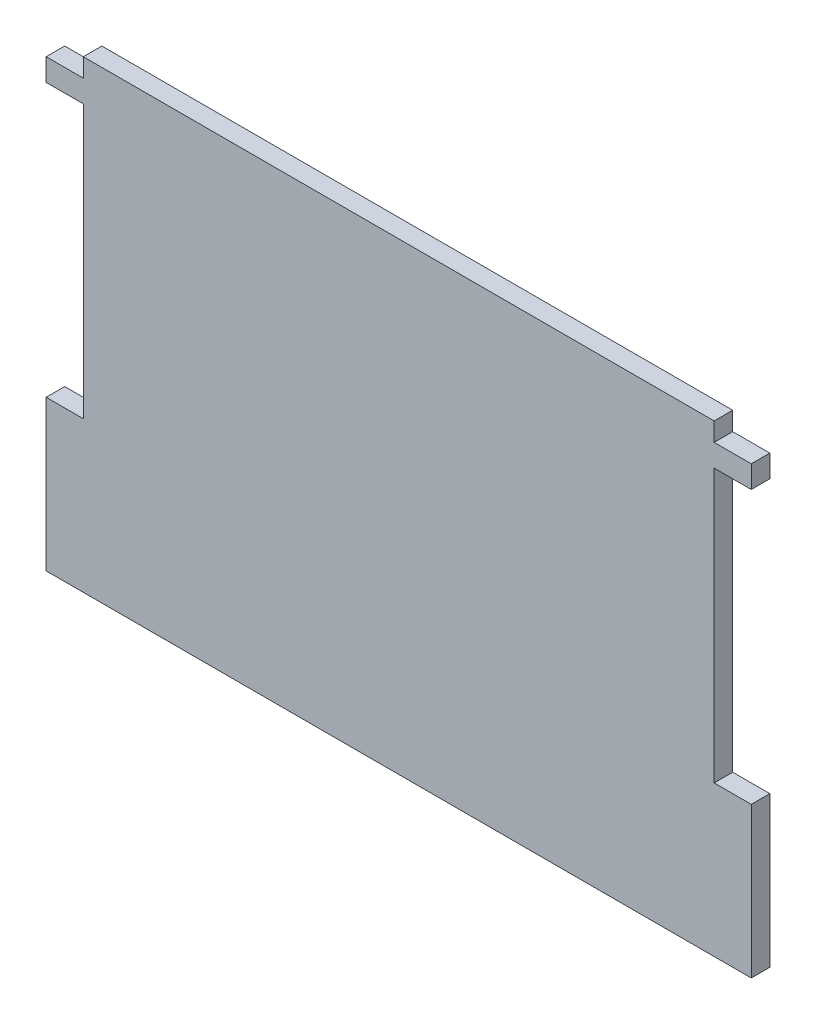
ISO-10303-21;
HEADER;
FILE_DESCRIPTION(('STEP AP214'),'2;1');
FILE_NAME('part.step','',(''),(''),'','','');
FILE_SCHEMA(('AUTOMOTIVE_DESIGN { 1 0 10303 214 1 1 1 1 }'));
ENDSEC;
DATA;
#1=APPLICATION_CONTEXT('core data for automotive mechanical design processes');
#2=APPLICATION_PROTOCOL_DEFINITION('international standard','automotive_design',2000,#1);
#3=PRODUCT_CONTEXT('',#1,'mechanical');
#4=PRODUCT('Part','Part','',(#3));
#5=PRODUCT_RELATED_PRODUCT_CATEGORY('part','',(#4));
#6=PRODUCT_DEFINITION_FORMATION('','',#4);
#7=PRODUCT_DEFINITION_CONTEXT('part definition',#1,'design');
#8=PRODUCT_DEFINITION('design','',#6,#7);
#9=PRODUCT_DEFINITION_SHAPE('','',#8);
#10=(LENGTH_UNIT() NAMED_UNIT(*) SI_UNIT(.MILLI.,.METRE.));
#11=(NAMED_UNIT(*) PLANE_ANGLE_UNIT() SI_UNIT($,.RADIAN.));
#12=(NAMED_UNIT(*) SI_UNIT($,.STERADIAN.) SOLID_ANGLE_UNIT());
#13=UNCERTAINTY_MEASURE_WITH_UNIT(LENGTH_MEASURE(1.E-05),#10,'distance_accuracy_value','');
#14=(GEOMETRIC_REPRESENTATION_CONTEXT(3) GLOBAL_UNCERTAINTY_ASSIGNED_CONTEXT((#13)) GLOBAL_UNIT_ASSIGNED_CONTEXT((#10,
#11,#12)) REPRESENTATION_CONTEXT('',''));
#15=CARTESIAN_POINT('',(0.,0.,0.));
#16=DIRECTION('',(0.,0.,1.));
#17=DIRECTION('',(1.,0.,0.));
#18=AXIS2_PLACEMENT_3D('',#15,#16,#17);
#19=CARTESIAN_POINT('',(0.,0.,0.));
#20=DIRECTION('',(0.,0.,-1.));
#21=DIRECTION('',(-1.,0.,0.));
#22=AXIS2_PLACEMENT_3D('',#19,#20,#21);
#23=PLANE('',#22);
#24=DIRECTION('',(1.,0.,0.));
#25=VECTOR('',#24,1.);
#26=CARTESIAN_POINT('',(-17.,-0.5,0.));
#27=LINE('',#26,#25);
#28=CARTESIAN_POINT('',(17.,-0.5,0.));
#29=VERTEX_POINT('',#28);
#30=CARTESIAN_POINT('',(-17.,-0.5,0.));
#31=VERTEX_POINT('',#30);
#32=EDGE_CURVE('E11',#29,#31,#27,.F.);
#33=ORIENTED_EDGE('',*,*,#32,.F.);
#34=DIRECTION('',(0.,1.,0.));
#35=VECTOR('',#34,1.);
#36=CARTESIAN_POINT('',(17.,-0.5,0.));
#37=LINE('',#36,#35);
#38=CARTESIAN_POINT('',(17.,-1.5,0.));
#39=VERTEX_POINT('',#38);
#40=EDGE_CURVE('E106',#39,#29,#37,.T.);
#41=ORIENTED_EDGE('',*,*,#40,.F.);
#42=DIRECTION('',(1.,0.,0.));
#43=VECTOR('',#42,1.);
#44=CARTESIAN_POINT('',(17.,-1.5,0.));
#45=LINE('',#44,#43);
#46=CARTESIAN_POINT('',(19.,-1.5,0.));
#47=VERTEX_POINT('',#46);
#48=EDGE_CURVE('E308',#47,#39,#45,.F.);
#49=ORIENTED_EDGE('',*,*,#48,.F.);
#50=DIRECTION('',(0.,1.,0.));
#51=VECTOR('',#50,1.);
#52=CARTESIAN_POINT('',(19.,-1.5,0.));
#53=LINE('',#52,#51);
#54=CARTESIAN_POINT('',(19.,-2.7,0.));
#55=VERTEX_POINT('',#54);
#56=EDGE_CURVE('E306',#55,#47,#53,.T.);
#57=ORIENTED_EDGE('',*,*,#56,.F.);
#58=DIRECTION('',(1.,0.,0.));
#59=VECTOR('',#58,1.);
#60=CARTESIAN_POINT('',(19.,-2.7,0.));
#61=LINE('',#60,#59);
#62=CARTESIAN_POINT('',(17.,-2.7,0.));
#63=VERTEX_POINT('',#62);
#64=EDGE_CURVE('E307',#63,#55,#61,.T.);
#65=ORIENTED_EDGE('',*,*,#64,.F.);
#66=DIRECTION('',(0.,1.,0.));
#67=VECTOR('',#66,1.);
#68=CARTESIAN_POINT('',(17.,-2.7,0.));
#69=LINE('',#68,#67);
#70=CARTESIAN_POINT('',(17.,-17.3947217067352,0.));
#71=VERTEX_POINT('',#70);
#72=EDGE_CURVE('E315',#71,#63,#69,.T.);
#73=ORIENTED_EDGE('',*,*,#72,.F.);
#74=DIRECTION('',(1.,0.,0.));
#75=VECTOR('',#74,1.);
#76=CARTESIAN_POINT('',(17.,-17.3947217067352,0.));
#77=LINE('',#76,#75);
#78=CARTESIAN_POINT('',(19.,-17.3947217067352,0.));
#79=VERTEX_POINT('',#78);
#80=EDGE_CURVE('E312',#79,#71,#77,.F.);
#81=ORIENTED_EDGE('',*,*,#80,.F.);
#82=DIRECTION('',(0.,1.,0.));
#83=VECTOR('',#82,1.);
#84=CARTESIAN_POINT('',(19.,-17.3947217067352,0.));
#85=LINE('',#84,#83);
#86=CARTESIAN_POINT('',(19.,-25.5,0.));
#87=VERTEX_POINT('',#86);
#88=EDGE_CURVE('E316',#87,#79,#85,.T.);
#89=ORIENTED_EDGE('',*,*,#88,.F.);
#90=DIRECTION('',(1.,0.,0.));
#91=VECTOR('',#90,1.);
#92=CARTESIAN_POINT('',(19.,-25.5,0.));
#93=LINE('',#92,#91);
#94=CARTESIAN_POINT('',(-19.,-25.5,0.));
#95=VERTEX_POINT('',#94);
#96=EDGE_CURVE('E318',#95,#87,#93,.T.);
#97=ORIENTED_EDGE('',*,*,#96,.F.);
#98=DIRECTION('',(0.,1.,0.));
#99=VECTOR('',#98,1.);
#100=CARTESIAN_POINT('',(-19.,-25.5,0.));
#101=LINE('',#100,#99);
#102=CARTESIAN_POINT('',(-19.,-17.3947217067352,0.));
#103=VERTEX_POINT('',#102);
#104=EDGE_CURVE('E319',#103,#95,#101,.F.);
#105=ORIENTED_EDGE('',*,*,#104,.F.);
#106=DIRECTION('',(1.,0.,0.));
#107=VECTOR('',#106,1.);
#108=CARTESIAN_POINT('',(-19.,-17.3947217067352,0.));
#109=LINE('',#108,#107);
#110=CARTESIAN_POINT('',(-17.,-17.3947217067352,0.));
#111=VERTEX_POINT('',#110);
#112=EDGE_CURVE('E325',#111,#103,#109,.F.);
#113=ORIENTED_EDGE('',*,*,#112,.F.);
#114=DIRECTION('',(0.,1.,0.));
#115=VECTOR('',#114,1.);
#116=CARTESIAN_POINT('',(-17.,-17.3947217067352,0.));
#117=LINE('',#116,#115);
#118=CARTESIAN_POINT('',(-17.,-2.7,0.));
#119=VERTEX_POINT('',#118);
#120=EDGE_CURVE('E323',#119,#111,#117,.F.);
#121=ORIENTED_EDGE('',*,*,#120,.F.);
#122=DIRECTION('',(1.,0.,0.));
#123=VECTOR('',#122,1.);
#124=CARTESIAN_POINT('',(-17.,-2.7,0.));
#125=LINE('',#124,#123);
#126=CARTESIAN_POINT('',(-19.,-2.7,0.));
#127=VERTEX_POINT('',#126);
#128=EDGE_CURVE('E327',#127,#119,#125,.T.);
#129=ORIENTED_EDGE('',*,*,#128,.F.);
#130=DIRECTION('',(0.,1.,0.));
#131=VECTOR('',#130,1.);
#132=CARTESIAN_POINT('',(-19.,-2.7,0.));
#133=LINE('',#132,#131);
#134=CARTESIAN_POINT('',(-19.,-1.5,0.));
#135=VERTEX_POINT('',#134);
#136=EDGE_CURVE('E329',#135,#127,#133,.F.);
#137=ORIENTED_EDGE('',*,*,#136,.F.);
#138=DIRECTION('',(1.,0.,0.));
#139=VECTOR('',#138,1.);
#140=CARTESIAN_POINT('',(-19.,-1.5,0.));
#141=LINE('',#140,#139);
#142=CARTESIAN_POINT('',(-17.,-1.5,0.));
#143=VERTEX_POINT('',#142);
#144=EDGE_CURVE('E328',#143,#135,#141,.F.);
#145=ORIENTED_EDGE('',*,*,#144,.F.);
#146=DIRECTION('',(0.,1.,0.));
#147=VECTOR('',#146,1.);
#148=CARTESIAN_POINT('',(-17.,-1.5,0.));
#149=LINE('',#148,#147);
#150=EDGE_CURVE('E48',#31,#143,#149,.F.);
#151=ORIENTED_EDGE('',*,*,#150,.F.);
#152=EDGE_LOOP('',(#33,#41,#49,#57,#65,#73,#81,#89,#97,#105,#113,#121,#129,#137,#145,#151));
#153=FACE_BOUND('',#152,.T.);
#154=CARTESIAN_POINT('',(1.92307692307694,-19.6153846153846,0.));
#155=CARTESIAN_POINT('',(1.77113809650168,-19.5202345564834,0.));
#156=CARTESIAN_POINT('',(1.46878250241927,-19.3308876118314,0.));
#157=CARTESIAN_POINT('',(1.0804243240048,-18.9568251895871,0.));
#158=CARTESIAN_POINT('',(0.760410940366441,-18.517308434697,0.));
#159=CARTESIAN_POINT('',(0.495090367822198,-18.0099272751774,0.));
#160=CARTESIAN_POINT('',(0.290092377329316,-17.4127986509036,0.));
#161=CARTESIAN_POINT('',(0.146567444426938,-16.7079392684701,0.));
#162=CARTESIAN_POINT('',(0.0444548234273604,-15.8921756964286,0.));
#163=CARTESIAN_POINT('',(0.0232473161701429,-15.3088405079473,0.));
#164=CARTESIAN_POINT('',(0.0120192307692477,-15.,0.));
#165=B_SPLINE_CURVE_WITH_KNOTS('',3,(#154,#155,#156,#157,#158,#159,#160,#161,#162,#163,#164),
.UNSPECIFIED.,.F.,.F.,(4,1,1,1,1,1,1,1,4),(0.,0.102367245238738,0.20370901859906,
0.30618529824539,0.412314489693373,0.530130196862162,0.666144691715152,0.823243917000724,1.),.UNSPECIFIED.);
#166=CARTESIAN_POINT('',(1.92307692307694,-19.6153846153846,0.));
#167=VERTEX_POINT('',#166);
#168=CARTESIAN_POINT('',(0.0120192307692477,-15.,0.));
#169=VERTEX_POINT('',#168);
#170=EDGE_CURVE('E216',#167,#169,#165,.T.);
#171=ORIENTED_EDGE('',*,*,#170,.T.);
#172=DIRECTION('',(1.,0.,0.));
#173=VECTOR('',#172,1.);
#174=CARTESIAN_POINT('',(0.0120192307692477,-15.,0.));
#175=LINE('',#174,#173);
#176=CARTESIAN_POINT('',(1.92307692307694,-15.,0.));
#177=VERTEX_POINT('',#176);
#178=EDGE_CURVE('E54',#169,#177,#175,.T.);
#179=ORIENTED_EDGE('',*,*,#178,.T.);
#180=DIRECTION('',(0.,1.,0.));
#181=VECTOR('',#180,1.);
#182=CARTESIAN_POINT('',(1.92307692307694,-15.,0.));
#183=LINE('',#182,#181);
#184=CARTESIAN_POINT('',(1.92307692307694,-11.1538461538462,0.));
#185=VERTEX_POINT('',#184);
#186=EDGE_CURVE('E225',#177,#185,#183,.T.);
#187=ORIENTED_EDGE('',*,*,#186,.T.);
#188=DIRECTION('',(-1.,0.,0.));
#189=VECTOR('',#188,1.);
#190=CARTESIAN_POINT('',(1.92307692307694,-11.1538461538462,0.));
#191=LINE('',#190,#189);
#192=CARTESIAN_POINT('',(-1.92307692307691,-11.1538461538462,0.));
#193=VERTEX_POINT('',#192);
#194=EDGE_CURVE('E727',#185,#193,#191,.T.);
#195=ORIENTED_EDGE('',*,*,#194,.T.);
#196=DIRECTION('',(0.,-1.,0.));
#197=VECTOR('',#196,1.);
#198=CARTESIAN_POINT('',(-1.92307692307691,-11.1538461538462,0.));
#199=LINE('',#198,#197);
#200=CARTESIAN_POINT('',(-1.92307692307691,-15.,0.));
#201=VERTEX_POINT('',#200);
#202=EDGE_CURVE('E724',#193,#201,#199,.T.);
#203=ORIENTED_EDGE('',*,*,#202,.T.);
#204=CARTESIAN_POINT('',(-1.92307692307691,-15.,0.));
#205=CARTESIAN_POINT('',(-1.91433657056015,-15.3810767358832,0.));
#206=CARTESIAN_POINT('',(-1.89766609116232,-16.1079046140902,0.));
#207=CARTESIAN_POINT('',(-1.76020005937377,-17.1394582093312,0.));
#208=CARTESIAN_POINT('',(-1.536476701543,-18.0601395414614,0.));
#209=CARTESIAN_POINT('',(-1.21069108944097,-18.8711982332195,0.));
#210=CARTESIAN_POINT('',(-0.785119946019379,-19.5855678421094,0.));
#211=CARTESIAN_POINT('',(-0.242975559569955,-20.2021133103051,0.));
#212=CARTESIAN_POINT('',(0.40399486861272,-20.737784557651,0.));
#213=CARTESIAN_POINT('',(0.900466251360351,-21.0132560811903,0.));
#214=CARTESIAN_POINT('',(1.15384615384617,-21.1538461538462,0.));
#215=B_SPLINE_CURVE_WITH_KNOTS('',3,(#204,#205,#206,#207,#208,#209,#210,#211,#212,#213,#214),
.UNSPECIFIED.,.F.,.F.,(4,1,1,1,1,1,1,1,4),(0.,0.156601585827271,0.298686294997552,
0.426910206074715,0.545117488967752,0.656687364828344,0.767001116976198,0.881086329823996,1.),.UNSPECIFIED.);
#216=CARTESIAN_POINT('',(1.15384615384617,-21.1538461538462,0.));
#217=VERTEX_POINT('',#216);
#218=EDGE_CURVE('E717',#201,#217,#215,.T.);
#219=ORIENTED_EDGE('',*,*,#218,.T.);
#220=DIRECTION('',(0.447213595499958,0.894427190999916,0.));
#221=VECTOR('',#220,1.);
#222=CARTESIAN_POINT('',(1.15384615384617,-21.1538461538462,0.));
#223=LINE('',#222,#221);
#224=EDGE_CURVE('E713',#217,#167,#223,.T.);
#225=ORIENTED_EDGE('',*,*,#224,.T.);
#226=EDGE_LOOP('',(#171,#179,#187,#195,#203,#219,#225));
#227=FACE_BOUND('',#226,.T.);
#228=ADVANCED_FACE('F39',(#153,#227),#23,.T.);
#229=CARTESIAN_POINT('',(-17.,-0.5,1.));
#230=DIRECTION('',(0.,-1.,0.));
#231=DIRECTION('',(0.,0.,-1.));
#232=AXIS2_PLACEMENT_3D('',#229,#230,#231);
#233=PLANE('',#232);
#234=ORIENTED_EDGE('',*,*,#32,.T.);
#235=DIRECTION('',(0.,0.,-1.));
#236=VECTOR('',#235,1.);
#237=CARTESIAN_POINT('',(-17.,-0.5,1.));
#238=LINE('',#237,#236);
#239=CARTESIAN_POINT('',(-17.,-0.5,1.));
#240=VERTEX_POINT('',#239);
#241=EDGE_CURVE('E223',#240,#31,#238,.T.);
#242=ORIENTED_EDGE('',*,*,#241,.F.);
#243=DIRECTION('',(-1.,0.,0.));
#244=VECTOR('',#243,1.);
#245=CARTESIAN_POINT('',(-17.,-0.5,1.));
#246=LINE('',#245,#244);
#247=CARTESIAN_POINT('',(17.,-0.5,1.));
#248=VERTEX_POINT('',#247);
#249=EDGE_CURVE('E265',#248,#240,#246,.T.);
#250=ORIENTED_EDGE('',*,*,#249,.F.);
#251=DIRECTION('',(0.,0.,-1.));
#252=VECTOR('',#251,1.);
#253=CARTESIAN_POINT('',(17.,-0.5,1.));
#254=LINE('',#253,#252);
#255=EDGE_CURVE('E234',#248,#29,#254,.T.);
#256=ORIENTED_EDGE('',*,*,#255,.T.);
#257=EDGE_LOOP('',(#234,#242,#250,#256));
#258=FACE_BOUND('',#257,.T.);
#259=ADVANCED_FACE('F404',(#258),#233,.F.);
#260=CARTESIAN_POINT('',(-17.,-1.5,1.));
#261=DIRECTION('',(1.,0.,0.));
#262=DIRECTION('',(0.,0.,-1.));
#263=AXIS2_PLACEMENT_3D('',#260,#261,#262);
#264=PLANE('',#263);
#265=ORIENTED_EDGE('',*,*,#150,.T.);
#266=DIRECTION('',(0.,0.,-1.));
#267=VECTOR('',#266,1.);
#268=CARTESIAN_POINT('',(-17.,-1.5,1.));
#269=LINE('',#268,#267);
#270=CARTESIAN_POINT('',(-17.,-1.5,1.));
#271=VERTEX_POINT('',#270);
#272=EDGE_CURVE('E226',#271,#143,#269,.T.);
#273=ORIENTED_EDGE('',*,*,#272,.F.);
#274=DIRECTION('',(0.,-1.,0.));
#275=VECTOR('',#274,1.);
#276=CARTESIAN_POINT('',(-17.,-1.5,1.));
#277=LINE('',#276,#275);
#278=EDGE_CURVE('E119',#240,#271,#277,.T.);
#279=ORIENTED_EDGE('',*,*,#278,.F.);
#280=ORIENTED_EDGE('',*,*,#241,.T.);
#281=EDGE_LOOP('',(#265,#273,#279,#280));
#282=FACE_BOUND('',#281,.T.);
#283=ADVANCED_FACE('F332',(#282),#264,.F.);
#284=CARTESIAN_POINT('',(-19.,-1.5,1.));
#285=DIRECTION('',(0.,-1.,0.));
#286=DIRECTION('',(1.,0.,0.));
#287=AXIS2_PLACEMENT_3D('',#284,#285,#286);
#288=PLANE('',#287);
#289=ORIENTED_EDGE('',*,*,#144,.T.);
#290=DIRECTION('',(0.,0.,-1.));
#291=VECTOR('',#290,1.);
#292=CARTESIAN_POINT('',(-19.,-1.5,1.));
#293=LINE('',#292,#291);
#294=CARTESIAN_POINT('',(-19.,-1.5,1.));
#295=VERTEX_POINT('',#294);
#296=EDGE_CURVE('E268',#295,#135,#293,.T.);
#297=ORIENTED_EDGE('',*,*,#296,.F.);
#298=DIRECTION('',(-1.,0.,0.));
#299=VECTOR('',#298,1.);
#300=CARTESIAN_POINT('',(-19.,-1.5,1.));
#301=LINE('',#300,#299);
#302=EDGE_CURVE('E260',#271,#295,#301,.T.);
#303=ORIENTED_EDGE('',*,*,#302,.F.);
#304=ORIENTED_EDGE('',*,*,#272,.T.);
#305=EDGE_LOOP('',(#289,#297,#303,#304));
#306=FACE_BOUND('',#305,.T.);
#307=ADVANCED_FACE('F336',(#306),#288,.F.);
#308=CARTESIAN_POINT('',(-19.,-2.7,1.));
#309=DIRECTION('',(1.,0.,0.));
#310=DIRECTION('',(0.,0.,-1.));
#311=AXIS2_PLACEMENT_3D('',#308,#309,#310);
#312=PLANE('',#311);
#313=ORIENTED_EDGE('',*,*,#136,.T.);
#314=DIRECTION('',(0.,0.,-1.));
#315=VECTOR('',#314,1.);
#316=CARTESIAN_POINT('',(-19.,-2.7,1.));
#317=LINE('',#316,#315);
#318=CARTESIAN_POINT('',(-19.,-2.7,1.));
#319=VERTEX_POINT('',#318);
#320=EDGE_CURVE('E271',#319,#127,#317,.T.);
#321=ORIENTED_EDGE('',*,*,#320,.F.);
#322=DIRECTION('',(0.,-1.,0.));
#323=VECTOR('',#322,1.);
#324=CARTESIAN_POINT('',(-19.,-2.7,1.));
#325=LINE('',#324,#323);
#326=EDGE_CURVE('E257',#295,#319,#325,.T.);
#327=ORIENTED_EDGE('',*,*,#326,.F.);
#328=ORIENTED_EDGE('',*,*,#296,.T.);
#329=EDGE_LOOP('',(#313,#321,#327,#328));
#330=FACE_BOUND('',#329,.T.);
#331=ADVANCED_FACE('F348',(#330),#312,.F.);
#332=CARTESIAN_POINT('',(-17.,-2.7,1.));
#333=DIRECTION('',(0.,1.,0.));
#334=DIRECTION('',(0.,0.,1.));
#335=AXIS2_PLACEMENT_3D('',#332,#333,#334);
#336=PLANE('',#335);
#337=ORIENTED_EDGE('',*,*,#128,.T.);
#338=DIRECTION('',(0.,0.,-1.));
#339=VECTOR('',#338,1.);
#340=CARTESIAN_POINT('',(-17.,-2.7,1.));
#341=LINE('',#340,#339);
#342=CARTESIAN_POINT('',(-17.,-2.7,1.));
#343=VERTEX_POINT('',#342);
#344=EDGE_CURVE('E272',#343,#119,#341,.T.);
#345=ORIENTED_EDGE('',*,*,#344,.F.);
#346=DIRECTION('',(1.,0.,0.));
#347=VECTOR('',#346,1.);
#348=CARTESIAN_POINT('',(-17.,-2.7,1.));
#349=LINE('',#348,#347);
#350=EDGE_CURVE('E253',#319,#343,#349,.T.);
#351=ORIENTED_EDGE('',*,*,#350,.F.);
#352=ORIENTED_EDGE('',*,*,#320,.T.);
#353=EDGE_LOOP('',(#337,#345,#351,#352));
#354=FACE_BOUND('',#353,.T.);
#355=ADVANCED_FACE('F349',(#354),#336,.F.);
#356=CARTESIAN_POINT('',(-17.,-17.3947217067352,1.));
#357=DIRECTION('',(1.,0.,0.));
#358=DIRECTION('',(0.,0.,-1.));
#359=AXIS2_PLACEMENT_3D('',#356,#357,#358);
#360=PLANE('',#359);
#361=ORIENTED_EDGE('',*,*,#120,.T.);
#362=DIRECTION('',(0.,0.,-1.));
#363=VECTOR('',#362,1.);
#364=CARTESIAN_POINT('',(-17.,-17.3947217067352,1.));
#365=LINE('',#364,#363);
#366=CARTESIAN_POINT('',(-17.,-17.3947217067352,1.));
#367=VERTEX_POINT('',#366);
#368=EDGE_CURVE('E280',#367,#111,#365,.T.);
#369=ORIENTED_EDGE('',*,*,#368,.F.);
#370=DIRECTION('',(0.,-1.,0.));
#371=VECTOR('',#370,1.);
#372=CARTESIAN_POINT('',(-17.,-17.3947217067352,1.));
#373=LINE('',#372,#371);
#374=EDGE_CURVE('E255',#343,#367,#373,.T.);
#375=ORIENTED_EDGE('',*,*,#374,.F.);
#376=ORIENTED_EDGE('',*,*,#344,.T.);
#377=EDGE_LOOP('',(#361,#369,#375,#376));
#378=FACE_BOUND('',#377,.T.);
#379=ADVANCED_FACE('F360',(#378),#360,.F.);
#380=CARTESIAN_POINT('',(-19.,-17.3947217067352,1.));
#381=DIRECTION('',(0.,-1.,0.));
#382=DIRECTION('',(0.,0.,-1.));
#383=AXIS2_PLACEMENT_3D('',#380,#381,#382);
#384=PLANE('',#383);
#385=ORIENTED_EDGE('',*,*,#112,.T.);
#386=DIRECTION('',(0.,0.,-1.));
#387=VECTOR('',#386,1.);
#388=CARTESIAN_POINT('',(-19.,-17.3947217067352,1.));
#389=LINE('',#388,#387);
#390=CARTESIAN_POINT('',(-19.,-17.3947217067352,1.));
#391=VERTEX_POINT('',#390);
#392=EDGE_CURVE('E279',#391,#103,#389,.T.);
#393=ORIENTED_EDGE('',*,*,#392,.F.);
#394=DIRECTION('',(-1.,0.,0.));
#395=VECTOR('',#394,1.);
#396=CARTESIAN_POINT('',(-19.,-17.3947217067352,1.));
#397=LINE('',#396,#395);
#398=EDGE_CURVE('E252',#367,#391,#397,.T.);
#399=ORIENTED_EDGE('',*,*,#398,.F.);
#400=ORIENTED_EDGE('',*,*,#368,.T.);
#401=EDGE_LOOP('',(#385,#393,#399,#400));
#402=FACE_BOUND('',#401,.T.);
#403=ADVANCED_FACE('F359',(#402),#384,.F.);
#404=CARTESIAN_POINT('',(-19.,-25.5,1.));
#405=DIRECTION('',(1.,0.,0.));
#406=DIRECTION('',(0.,0.,-1.));
#407=AXIS2_PLACEMENT_3D('',#404,#405,#406);
#408=PLANE('',#407);
#409=ORIENTED_EDGE('',*,*,#104,.T.);
#410=DIRECTION('',(0.,0.,-1.));
#411=VECTOR('',#410,1.);
#412=CARTESIAN_POINT('',(-19.,-25.5,1.));
#413=LINE('',#412,#411);
#414=CARTESIAN_POINT('',(-19.,-25.5,1.));
#415=VERTEX_POINT('',#414);
#416=EDGE_CURVE('E284',#415,#95,#413,.T.);
#417=ORIENTED_EDGE('',*,*,#416,.F.);
#418=DIRECTION('',(0.,-1.,0.));
#419=VECTOR('',#418,1.);
#420=CARTESIAN_POINT('',(-19.,-25.5,1.));
#421=LINE('',#420,#419);
#422=EDGE_CURVE('E249',#391,#415,#421,.T.);
#423=ORIENTED_EDGE('',*,*,#422,.F.);
#424=ORIENTED_EDGE('',*,*,#392,.T.);
#425=EDGE_LOOP('',(#409,#417,#423,#424));
#426=FACE_BOUND('',#425,.T.);
#427=ADVANCED_FACE('F364',(#426),#408,.F.);
#428=CARTESIAN_POINT('',(19.,-25.5,1.));
#429=DIRECTION('',(0.,1.,0.));
#430=DIRECTION('',(0.,0.,1.));
#431=AXIS2_PLACEMENT_3D('',#428,#429,#430);
#432=PLANE('',#431);
#433=ORIENTED_EDGE('',*,*,#96,.T.);
#434=DIRECTION('',(0.,0.,-1.));
#435=VECTOR('',#434,1.);
#436=CARTESIAN_POINT('',(19.,-25.5,1.));
#437=LINE('',#436,#435);
#438=CARTESIAN_POINT('',(19.,-25.5,1.));
#439=VERTEX_POINT('',#438);
#440=EDGE_CURVE('E287',#439,#87,#437,.T.);
#441=ORIENTED_EDGE('',*,*,#440,.F.);
#442=DIRECTION('',(1.,0.,0.));
#443=VECTOR('',#442,1.);
#444=CARTESIAN_POINT('',(19.,-25.5,1.));
#445=LINE('',#444,#443);
#446=EDGE_CURVE('E250',#415,#439,#445,.T.);
#447=ORIENTED_EDGE('',*,*,#446,.F.);
#448=ORIENTED_EDGE('',*,*,#416,.T.);
#449=EDGE_LOOP('',(#433,#441,#447,#448));
#450=FACE_BOUND('',#449,.T.);
#451=ADVANCED_FACE('F372',(#450),#432,.F.);
#452=CARTESIAN_POINT('',(19.,-17.3947217067352,1.));
#453=DIRECTION('',(-1.,0.,0.));
#454=DIRECTION('',(0.,0.,1.));
#455=AXIS2_PLACEMENT_3D('',#452,#453,#454);
#456=PLANE('',#455);
#457=ORIENTED_EDGE('',*,*,#88,.T.);
#458=DIRECTION('',(0.,0.,-1.));
#459=VECTOR('',#458,1.);
#460=CARTESIAN_POINT('',(19.,-17.3947217067352,1.));
#461=LINE('',#460,#459);
#462=CARTESIAN_POINT('',(19.,-17.3947217067352,1.));
#463=VERTEX_POINT('',#462);
#464=EDGE_CURVE('E286',#463,#79,#461,.T.);
#465=ORIENTED_EDGE('',*,*,#464,.F.);
#466=DIRECTION('',(0.,1.,0.));
#467=VECTOR('',#466,1.);
#468=CARTESIAN_POINT('',(19.,-17.3947217067352,1.));
#469=LINE('',#468,#467);
#470=EDGE_CURVE('E243',#439,#463,#469,.T.);
#471=ORIENTED_EDGE('',*,*,#470,.F.);
#472=ORIENTED_EDGE('',*,*,#440,.T.);
#473=EDGE_LOOP('',(#457,#465,#471,#472));
#474=FACE_BOUND('',#473,.T.);
#475=ADVANCED_FACE('F373',(#474),#456,.F.);
#476=CARTESIAN_POINT('',(17.,-17.3947217067352,1.));
#477=DIRECTION('',(0.,-1.,0.));
#478=DIRECTION('',(0.,0.,-1.));
#479=AXIS2_PLACEMENT_3D('',#476,#477,#478);
#480=PLANE('',#479);
#481=ORIENTED_EDGE('',*,*,#80,.T.);
#482=DIRECTION('',(0.,0.,-1.));
#483=VECTOR('',#482,1.);
#484=CARTESIAN_POINT('',(17.,-17.3947217067352,1.));
#485=LINE('',#484,#483);
#486=CARTESIAN_POINT('',(17.,-17.3947217067352,1.));
#487=VERTEX_POINT('',#486);
#488=EDGE_CURVE('E295',#487,#71,#485,.T.);
#489=ORIENTED_EDGE('',*,*,#488,.F.);
#490=DIRECTION('',(-1.,0.,0.));
#491=VECTOR('',#490,1.);
#492=CARTESIAN_POINT('',(17.,-17.3947217067352,1.));
#493=LINE('',#492,#491);
#494=EDGE_CURVE('E245',#463,#487,#493,.T.);
#495=ORIENTED_EDGE('',*,*,#494,.F.);
#496=ORIENTED_EDGE('',*,*,#464,.T.);
#497=EDGE_LOOP('',(#481,#489,#495,#496));
#498=FACE_BOUND('',#497,.T.);
#499=ADVANCED_FACE('F378',(#498),#480,.F.);
#500=CARTESIAN_POINT('',(17.,-2.7,1.));
#501=DIRECTION('',(-1.,0.,0.));
#502=DIRECTION('',(0.,0.,1.));
#503=AXIS2_PLACEMENT_3D('',#500,#501,#502);
#504=PLANE('',#503);
#505=ORIENTED_EDGE('',*,*,#72,.T.);
#506=DIRECTION('',(0.,0.,-1.));
#507=VECTOR('',#506,1.);
#508=CARTESIAN_POINT('',(17.,-2.7,1.));
#509=LINE('',#508,#507);
#510=CARTESIAN_POINT('',(17.,-2.7,1.));
#511=VERTEX_POINT('',#510);
#512=EDGE_CURVE('E293',#511,#63,#509,.T.);
#513=ORIENTED_EDGE('',*,*,#512,.F.);
#514=DIRECTION('',(0.,1.,0.));
#515=VECTOR('',#514,1.);
#516=CARTESIAN_POINT('',(17.,-2.7,1.));
#517=LINE('',#516,#515);
#518=EDGE_CURVE('E242',#487,#511,#517,.T.);
#519=ORIENTED_EDGE('',*,*,#518,.F.);
#520=ORIENTED_EDGE('',*,*,#488,.T.);
#521=EDGE_LOOP('',(#505,#513,#519,#520));
#522=FACE_BOUND('',#521,.T.);
#523=ADVANCED_FACE('F387',(#522),#504,.F.);
#524=CARTESIAN_POINT('',(19.,-2.7,1.));
#525=DIRECTION('',(0.,1.,0.));
#526=DIRECTION('',(0.,0.,1.));
#527=AXIS2_PLACEMENT_3D('',#524,#525,#526);
#528=PLANE('',#527);
#529=ORIENTED_EDGE('',*,*,#64,.T.);
#530=DIRECTION('',(0.,0.,-1.));
#531=VECTOR('',#530,1.);
#532=CARTESIAN_POINT('',(19.,-2.7,1.));
#533=LINE('',#532,#531);
#534=CARTESIAN_POINT('',(19.,-2.7,1.));
#535=VERTEX_POINT('',#534);
#536=EDGE_CURVE('E300',#535,#55,#533,.T.);
#537=ORIENTED_EDGE('',*,*,#536,.F.);
#538=DIRECTION('',(1.,0.,0.));
#539=VECTOR('',#538,1.);
#540=CARTESIAN_POINT('',(19.,-2.7,1.));
#541=LINE('',#540,#539);
#542=EDGE_CURVE('E236',#511,#535,#541,.T.);
#543=ORIENTED_EDGE('',*,*,#542,.F.);
#544=ORIENTED_EDGE('',*,*,#512,.T.);
#545=EDGE_LOOP('',(#529,#537,#543,#544));
#546=FACE_BOUND('',#545,.T.);
#547=ADVANCED_FACE('F388',(#546),#528,.F.);
#548=CARTESIAN_POINT('',(19.,-1.5,1.));
#549=DIRECTION('',(-1.,0.,0.));
#550=DIRECTION('',(0.,0.,1.));
#551=AXIS2_PLACEMENT_3D('',#548,#549,#550);
#552=PLANE('',#551);
#553=ORIENTED_EDGE('',*,*,#56,.T.);
#554=DIRECTION('',(0.,0.,-1.));
#555=VECTOR('',#554,1.);
#556=CARTESIAN_POINT('',(19.,-1.5,1.));
#557=LINE('',#556,#555);
#558=CARTESIAN_POINT('',(19.,-1.5,1.));
#559=VERTEX_POINT('',#558);
#560=EDGE_CURVE('E303',#559,#47,#557,.T.);
#561=ORIENTED_EDGE('',*,*,#560,.F.);
#562=DIRECTION('',(0.,1.,0.));
#563=VECTOR('',#562,1.);
#564=CARTESIAN_POINT('',(19.,-1.5,1.));
#565=LINE('',#564,#563);
#566=EDGE_CURVE('E240',#535,#559,#565,.T.);
#567=ORIENTED_EDGE('',*,*,#566,.F.);
#568=ORIENTED_EDGE('',*,*,#536,.T.);
#569=EDGE_LOOP('',(#553,#561,#567,#568));
#570=FACE_BOUND('',#569,.T.);
#571=ADVANCED_FACE('F394',(#570),#552,.F.);
#572=CARTESIAN_POINT('',(17.,-1.5,1.));
#573=DIRECTION('',(0.,-1.,0.));
#574=DIRECTION('',(1.,0.,0.));
#575=AXIS2_PLACEMENT_3D('',#572,#573,#574);
#576=PLANE('',#575);
#577=ORIENTED_EDGE('',*,*,#48,.T.);
#578=DIRECTION('',(0.,0.,-1.));
#579=VECTOR('',#578,1.);
#580=CARTESIAN_POINT('',(17.,-1.5,1.));
#581=LINE('',#580,#579);
#582=CARTESIAN_POINT('',(17.,-1.5,1.));
#583=VERTEX_POINT('',#582);
#584=EDGE_CURVE('E264',#583,#39,#581,.T.);
#585=ORIENTED_EDGE('',*,*,#584,.F.);
#586=DIRECTION('',(-1.,0.,0.));
#587=VECTOR('',#586,1.);
#588=CARTESIAN_POINT('',(17.,-1.5,1.));
#589=LINE('',#588,#587);
#590=EDGE_CURVE('E233',#559,#583,#589,.T.);
#591=ORIENTED_EDGE('',*,*,#590,.F.);
#592=ORIENTED_EDGE('',*,*,#560,.T.);
#593=EDGE_LOOP('',(#577,#585,#591,#592));
#594=FACE_BOUND('',#593,.T.);
#595=ADVANCED_FACE('F397',(#594),#576,.F.);
#596=CARTESIAN_POINT('',(17.,-0.5,1.));
#597=DIRECTION('',(-1.,0.,0.));
#598=DIRECTION('',(0.,0.,1.));
#599=AXIS2_PLACEMENT_3D('',#596,#597,#598);
#600=PLANE('',#599);
#601=ORIENTED_EDGE('',*,*,#40,.T.);
#602=ORIENTED_EDGE('',*,*,#255,.F.);
#603=DIRECTION('',(0.,1.,0.));
#604=VECTOR('',#603,1.);
#605=CARTESIAN_POINT('',(17.,-0.5,1.));
#606=LINE('',#605,#604);
#607=EDGE_CURVE('E235',#583,#248,#606,.T.);
#608=ORIENTED_EDGE('',*,*,#607,.F.);
#609=ORIENTED_EDGE('',*,*,#584,.T.);
#610=EDGE_LOOP('',(#601,#602,#608,#609));
#611=FACE_BOUND('',#610,.T.);
#612=ADVANCED_FACE('F405',(#611),#600,.F.);
#613=CARTESIAN_POINT('',(0.,0.,1.));
#614=DIRECTION('',(0.,0.,-1.));
#615=DIRECTION('',(-1.,0.,0.));
#616=AXIS2_PLACEMENT_3D('',#613,#614,#615);
#617=PLANE('',#616);
#618=ORIENTED_EDGE('',*,*,#249,.T.);
#619=ORIENTED_EDGE('',*,*,#278,.T.);
#620=ORIENTED_EDGE('',*,*,#302,.T.);
#621=ORIENTED_EDGE('',*,*,#326,.T.);
#622=ORIENTED_EDGE('',*,*,#350,.T.);
#623=ORIENTED_EDGE('',*,*,#374,.T.);
#624=ORIENTED_EDGE('',*,*,#398,.T.);
#625=ORIENTED_EDGE('',*,*,#422,.T.);
#626=ORIENTED_EDGE('',*,*,#446,.T.);
#627=ORIENTED_EDGE('',*,*,#470,.T.);
#628=ORIENTED_EDGE('',*,*,#494,.T.);
#629=ORIENTED_EDGE('',*,*,#518,.T.);
#630=ORIENTED_EDGE('',*,*,#542,.T.);
#631=ORIENTED_EDGE('',*,*,#566,.T.);
#632=ORIENTED_EDGE('',*,*,#590,.T.);
#633=ORIENTED_EDGE('',*,*,#607,.T.);
#634=EDGE_LOOP('',(#618,#619,#620,#621,#622,#623,#624,#625,#626,#627,#628,#629,#630,#631,#632,#633));
#635=FACE_BOUND('',#634,.T.);
#636=ADVANCED_FACE('F41',(#635),#617,.F.);
#637=CARTESIAN_POINT('',(0.0120192307692477,-15.,0.5));
#638=DIRECTION('',(0.,1.,0.));
#639=DIRECTION('',(0.,0.,1.));
#640=AXIS2_PLACEMENT_3D('',#637,#638,#639);
#641=PLANE('',#640);
#642=ORIENTED_EDGE('',*,*,#178,.F.);
#643=DIRECTION('',(0.,0.,-1.));
#644=VECTOR('',#643,1.);
#645=CARTESIAN_POINT('',(0.0120192307692477,-15.,0.5));
#646=LINE('',#645,#644);
#647=CARTESIAN_POINT('',(0.0120192307692477,-15.,0.5));
#648=VERTEX_POINT('',#647);
#649=EDGE_CURVE('E220',#648,#169,#646,.T.);
#650=ORIENTED_EDGE('',*,*,#649,.F.);
#651=DIRECTION('',(1.,0.,0.));
#652=VECTOR('',#651,1.);
#653=CARTESIAN_POINT('',(0.0120192307692477,-15.,0.5));
#654=LINE('',#653,#652);
#655=CARTESIAN_POINT('',(1.92307692307694,-15.,0.5));
#656=VERTEX_POINT('',#655);
#657=EDGE_CURVE('E210',#648,#656,#654,.T.);
#658=ORIENTED_EDGE('',*,*,#657,.T.);
#659=DIRECTION('',(0.,0.,-1.));
#660=VECTOR('',#659,1.);
#661=CARTESIAN_POINT('',(1.92307692307694,-15.,0.5));
#662=LINE('',#661,#660);
#663=EDGE_CURVE('E218',#656,#177,#662,.T.);
#664=ORIENTED_EDGE('',*,*,#663,.T.);
#665=EDGE_LOOP('',(#642,#650,#658,#664));
#666=FACE_BOUND('',#665,.T.);
#667=ADVANCED_FACE('F214',(#666),#641,.T.);
#668=CARTESIAN_POINT('',(1.92307692307694,-15.,0.5));
#669=DIRECTION('',(-1.,0.,0.));
#670=DIRECTION('',(0.,0.,1.));
#671=AXIS2_PLACEMENT_3D('',#668,#669,#670);
#672=PLANE('',#671);
#673=ORIENTED_EDGE('',*,*,#186,.F.);
#674=ORIENTED_EDGE('',*,*,#663,.F.);
#675=DIRECTION('',(0.,1.,0.));
#676=VECTOR('',#675,1.);
#677=CARTESIAN_POINT('',(1.92307692307694,-15.,0.5));
#678=LINE('',#677,#676);
#679=CARTESIAN_POINT('',(1.92307692307694,-11.1538461538462,0.5));
#680=VERTEX_POINT('',#679);
#681=EDGE_CURVE('E204',#656,#680,#678,.T.);
#682=ORIENTED_EDGE('',*,*,#681,.T.);
#683=DIRECTION('',(0.,0.,-1.));
#684=VECTOR('',#683,1.);
#685=CARTESIAN_POINT('',(1.92307692307694,-11.1538461538462,0.5));
#686=LINE('',#685,#684);
#687=EDGE_CURVE('E222',#680,#185,#686,.T.);
#688=ORIENTED_EDGE('',*,*,#687,.T.);
#689=EDGE_LOOP('',(#673,#674,#682,#688));
#690=FACE_BOUND('',#689,.T.);
#691=ADVANCED_FACE('F217',(#690),#672,.T.);
#692=CARTESIAN_POINT('',(1.92307692307694,-11.1538461538462,0.5));
#693=DIRECTION('',(0.,-1.,0.));
#694=DIRECTION('',(0.,0.,-1.));
#695=AXIS2_PLACEMENT_3D('',#692,#693,#694);
#696=PLANE('',#695);
#697=ORIENTED_EDGE('',*,*,#194,.F.);
#698=ORIENTED_EDGE('',*,*,#687,.F.);
#699=DIRECTION('',(-1.,0.,0.));
#700=VECTOR('',#699,1.);
#701=CARTESIAN_POINT('',(1.92307692307694,-11.1538461538462,0.5));
#702=LINE('',#701,#700);
#703=CARTESIAN_POINT('',(-1.92307692307691,-11.1538461538462,0.5));
#704=VERTEX_POINT('',#703);
#705=EDGE_CURVE('E208',#680,#704,#702,.T.);
#706=ORIENTED_EDGE('',*,*,#705,.T.);
#707=DIRECTION('',(0.,0.,-1.));
#708=VECTOR('',#707,1.);
#709=CARTESIAN_POINT('',(-1.92307692307691,-11.1538461538462,0.5));
#710=LINE('',#709,#708);
#711=EDGE_CURVE('E228',#704,#193,#710,.T.);
#712=ORIENTED_EDGE('',*,*,#711,.T.);
#713=EDGE_LOOP('',(#697,#698,#706,#712));
#714=FACE_BOUND('',#713,.T.);
#715=ADVANCED_FACE('F452',(#714),#696,.T.);
#716=CARTESIAN_POINT('',(-1.92307692307691,-11.1538461538462,0.5));
#717=DIRECTION('',(1.,0.,0.));
#718=DIRECTION('',(0.,0.,-1.));
#719=AXIS2_PLACEMENT_3D('',#716,#717,#718);
#720=PLANE('',#719);
#721=ORIENTED_EDGE('',*,*,#202,.F.);
#722=ORIENTED_EDGE('',*,*,#711,.F.);
#723=DIRECTION('',(0.,-1.,0.));
#724=VECTOR('',#723,1.);
#725=CARTESIAN_POINT('',(-1.92307692307691,-11.1538461538462,0.5));
#726=LINE('',#725,#724);
#727=CARTESIAN_POINT('',(-1.92307692307691,-15.,0.5));
#728=VERTEX_POINT('',#727);
#729=EDGE_CURVE('E478',#704,#728,#726,.T.);
#730=ORIENTED_EDGE('',*,*,#729,.T.);
#731=DIRECTION('',(0.,0.,-1.));
#732=VECTOR('',#731,1.);
#733=CARTESIAN_POINT('',(-1.92307692307691,-15.,0.5));
#734=LINE('',#733,#732);
#735=EDGE_CURVE('E747',#728,#201,#734,.T.);
#736=ORIENTED_EDGE('',*,*,#735,.T.);
#737=EDGE_LOOP('',(#721,#722,#730,#736));
#738=FACE_BOUND('',#737,.T.);
#739=ADVANCED_FACE('F458',(#738),#720,.T.);
#740=CARTESIAN_POINT('',(-1.92307692307691,-15.,0.5));
#741=CARTESIAN_POINT('',(-1.91433657056015,-15.3810767358832,0.5));
#742=CARTESIAN_POINT('',(-1.89766609116232,-16.1079046140902,0.5));
#743=CARTESIAN_POINT('',(-1.76020005937377,-17.1394582093312,0.5));
#744=CARTESIAN_POINT('',(-1.536476701543,-18.0601395414614,0.5));
#745=CARTESIAN_POINT('',(-1.21069108944097,-18.8711982332195,0.5));
#746=CARTESIAN_POINT('',(-0.785119946019379,-19.5855678421094,0.5));
#747=CARTESIAN_POINT('',(-0.242975559569955,-20.2021133103051,0.5));
#748=CARTESIAN_POINT('',(0.40399486861272,-20.737784557651,0.5));
#749=CARTESIAN_POINT('',(0.900466251360351,-21.0132560811903,0.5));
#750=CARTESIAN_POINT('',(1.15384615384617,-21.1538461538462,0.5));
#751=B_SPLINE_CURVE_WITH_KNOTS('',3,(#740,#741,#742,#743,#744,#745,#746,#747,#748,#749,#750),
.UNSPECIFIED.,.F.,.F.,(4,1,1,1,1,1,1,1,4),(0.,0.156601585827271,0.298686294997552,
0.426910206074715,0.545117488967752,0.656687364828344,0.767001116976198,0.881086329823996,1.),.UNSPECIFIED.);
#752=DIRECTION('',(0.,0.,-1.));
#753=VECTOR('',#752,1.);
#754=SURFACE_OF_LINEAR_EXTRUSION('',#751,#753);
#755=ORIENTED_EDGE('',*,*,#218,.F.);
#756=ORIENTED_EDGE('',*,*,#735,.F.);
#757=CARTESIAN_POINT('',(1.15384615384617,-21.1538461538462,0.5));
#758=VERTEX_POINT('',#757);
#759=EDGE_CURVE('E471',#728,#758,#751,.T.);
#760=ORIENTED_EDGE('',*,*,#759,.T.);
#761=DIRECTION('',(0.,0.,-1.));
#762=VECTOR('',#761,1.);
#763=CARTESIAN_POINT('',(1.15384615384617,-21.1538461538462,0.5));
#764=LINE('',#763,#762);
#765=EDGE_CURVE('E711',#758,#217,#764,.T.);
#766=ORIENTED_EDGE('',*,*,#765,.T.);
#767=EDGE_LOOP('',(#755,#756,#760,#766));
#768=FACE_BOUND('',#767,.T.);
#769=ADVANCED_FACE('F463',(#768),#754,.T.);
#770=CARTESIAN_POINT('',(1.15384615384617,-21.1538461538462,0.5));
#771=DIRECTION('',(-0.894427190999916,0.447213595499958,0.));
#772=DIRECTION('',(-0.447213595499958,-0.894427190999916,0.));
#773=AXIS2_PLACEMENT_3D('',#770,#771,#772);
#774=PLANE('',#773);
#775=ORIENTED_EDGE('',*,*,#224,.F.);
#776=ORIENTED_EDGE('',*,*,#765,.F.);
#777=DIRECTION('',(0.447213595499958,0.894427190999916,0.));
#778=VECTOR('',#777,1.);
#779=CARTESIAN_POINT('',(1.15384615384617,-21.1538461538462,0.5));
#780=LINE('',#779,#778);
#781=CARTESIAN_POINT('',(1.92307692307694,-19.6153846153846,0.5));
#782=VERTEX_POINT('',#781);
#783=EDGE_CURVE('E476',#758,#782,#780,.T.);
#784=ORIENTED_EDGE('',*,*,#783,.T.);
#785=DIRECTION('',(0.,0.,-1.));
#786=VECTOR('',#785,1.);
#787=CARTESIAN_POINT('',(1.92307692307694,-19.6153846153846,0.5));
#788=LINE('',#787,#786);
#789=EDGE_CURVE('E716',#782,#167,#788,.T.);
#790=ORIENTED_EDGE('',*,*,#789,.T.);
#791=EDGE_LOOP('',(#775,#776,#784,#790));
#792=FACE_BOUND('',#791,.T.);
#793=ADVANCED_FACE('F468',(#792),#774,.T.);
#794=CARTESIAN_POINT('',(1.92307692307694,-19.6153846153846,0.5));
#795=CARTESIAN_POINT('',(1.77113809650168,-19.5202345564834,0.5));
#796=CARTESIAN_POINT('',(1.46878250241927,-19.3308876118314,0.5));
#797=CARTESIAN_POINT('',(1.0804243240048,-18.9568251895871,0.5));
#798=CARTESIAN_POINT('',(0.760410940366441,-18.517308434697,0.5));
#799=CARTESIAN_POINT('',(0.495090367822198,-18.0099272751774,0.5));
#800=CARTESIAN_POINT('',(0.290092377329316,-17.4127986509036,0.5));
#801=CARTESIAN_POINT('',(0.146567444426938,-16.7079392684701,0.5));
#802=CARTESIAN_POINT('',(0.0444548234273604,-15.8921756964286,0.5));
#803=CARTESIAN_POINT('',(0.0232473161701429,-15.3088405079473,0.5));
#804=CARTESIAN_POINT('',(0.0120192307692477,-15.,0.5));
#805=B_SPLINE_CURVE_WITH_KNOTS('',3,(#794,#795,#796,#797,#798,#799,#800,#801,#802,#803,#804),
.UNSPECIFIED.,.F.,.F.,(4,1,1,1,1,1,1,1,4),(0.,0.102367245238738,0.20370901859906,
0.30618529824539,0.412314489693373,0.530130196862162,0.666144691715152,0.823243917000724,1.),.UNSPECIFIED.);
#806=DIRECTION('',(0.,0.,-1.));
#807=VECTOR('',#806,1.);
#808=SURFACE_OF_LINEAR_EXTRUSION('',#805,#807);
#809=ORIENTED_EDGE('',*,*,#170,.F.);
#810=ORIENTED_EDGE('',*,*,#789,.F.);
#811=EDGE_CURVE('E488',#782,#648,#805,.T.);
#812=ORIENTED_EDGE('',*,*,#811,.T.);
#813=ORIENTED_EDGE('',*,*,#649,.T.);
#814=EDGE_LOOP('',(#809,#810,#812,#813));
#815=FACE_BOUND('',#814,.T.);
#816=ADVANCED_FACE('F494',(#815),#808,.T.);
#817=CARTESIAN_POINT('',(-1.32186310897958,-18.5768912093183,0.5));
#818=DIRECTION('',(0.,0.,-1.));
#819=DIRECTION('',(-1.,0.,0.));
#820=AXIS2_PLACEMENT_3D('',#817,#818,#819);
#821=PLANE('',#820);
#822=ORIENTED_EDGE('',*,*,#657,.F.);
#823=ORIENTED_EDGE('',*,*,#811,.F.);
#824=ORIENTED_EDGE('',*,*,#783,.F.);
#825=ORIENTED_EDGE('',*,*,#759,.F.);
#826=ORIENTED_EDGE('',*,*,#729,.F.);
#827=ORIENTED_EDGE('',*,*,#705,.F.);
#828=ORIENTED_EDGE('',*,*,#681,.F.);
#829=EDGE_LOOP('',(#822,#823,#824,#825,#826,#827,#828));
#830=FACE_BOUND('',#829,.T.);
#831=ADVANCED_FACE('F207',(#830),#821,.T.);
#832=CLOSED_SHELL('',(#228,#259,#283,#307,#331,#355,#379,#403,#427,#451,#475,#499,#523,#547,
#571,#595,#612,#636,#667,#691,#715,#739,#769,#793,#816,#831));
#833=MANIFOLD_SOLID_BREP('B2',#832);
#834=ADVANCED_BREP_SHAPE_REPRESENTATION('',(#18,#833),#14);
#835=SHAPE_DEFINITION_REPRESENTATION(#9,#834);
ENDSEC;
END-ISO-10303-21;
